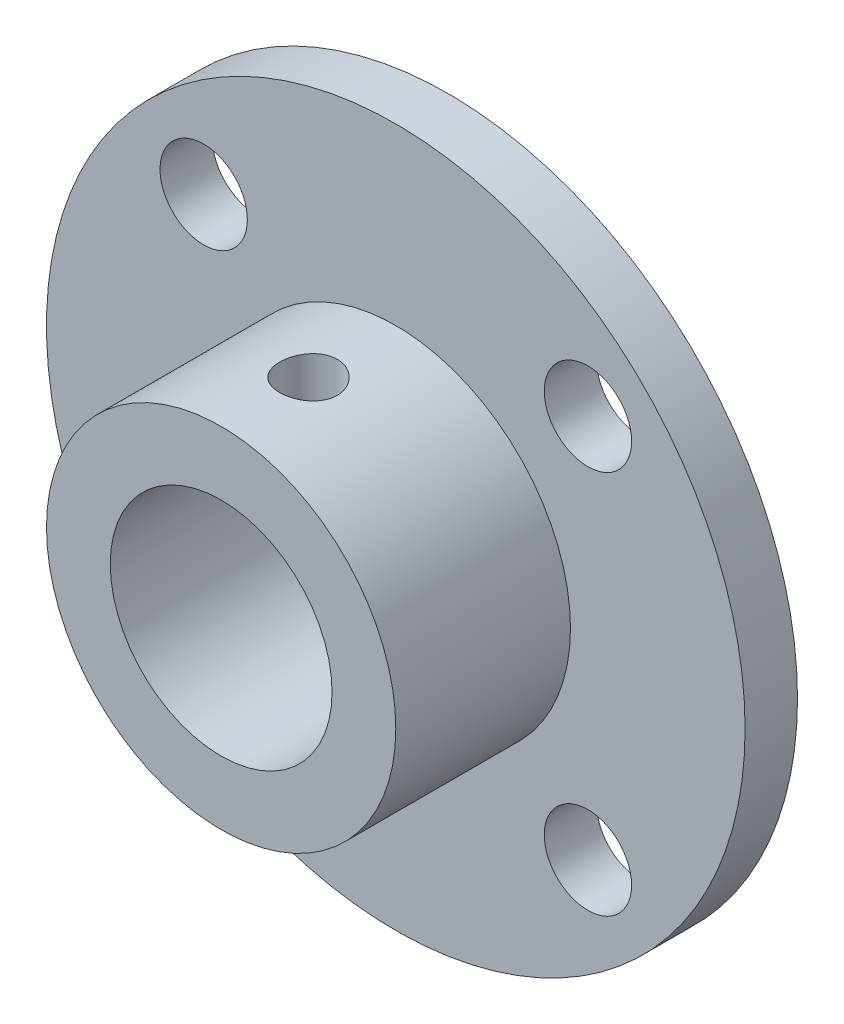
ISO-10303-21;
HEADER;
FILE_DESCRIPTION(('STEP AP214'),'2;1');
FILE_NAME('part.step','',(''),(''),'','','');
FILE_SCHEMA(('AUTOMOTIVE_DESIGN { 1 0 10303 214 1 1 1 1 }'));
ENDSEC;
DATA;
#1=APPLICATION_CONTEXT('core data for automotive mechanical design processes');
#2=APPLICATION_PROTOCOL_DEFINITION('international standard','automotive_design',2000,#1);
#3=PRODUCT_CONTEXT('',#1,'mechanical');
#4=PRODUCT('Part','Part','',(#3));
#5=PRODUCT_RELATED_PRODUCT_CATEGORY('part','',(#4));
#6=PRODUCT_DEFINITION_FORMATION('','',#4);
#7=PRODUCT_DEFINITION_CONTEXT('part definition',#1,'design');
#8=PRODUCT_DEFINITION('design','',#6,#7);
#9=PRODUCT_DEFINITION_SHAPE('','',#8);
#10=(LENGTH_UNIT() NAMED_UNIT(*) SI_UNIT(.MILLI.,.METRE.));
#11=(NAMED_UNIT(*) PLANE_ANGLE_UNIT() SI_UNIT($,.RADIAN.));
#12=(NAMED_UNIT(*) SI_UNIT($,.STERADIAN.) SOLID_ANGLE_UNIT());
#13=UNCERTAINTY_MEASURE_WITH_UNIT(LENGTH_MEASURE(1.E-05),#10,'distance_accuracy_value','');
#14=(GEOMETRIC_REPRESENTATION_CONTEXT(3) GLOBAL_UNCERTAINTY_ASSIGNED_CONTEXT((#13)) GLOBAL_UNIT_ASSIGNED_CONTEXT((#10,
#11,#12)) REPRESENTATION_CONTEXT('',''));
#15=CARTESIAN_POINT('',(0.,0.,0.));
#16=DIRECTION('',(0.,0.,1.));
#17=DIRECTION('',(1.,0.,0.));
#18=AXIS2_PLACEMENT_3D('',#15,#16,#17);
#19=CARTESIAN_POINT('',(0.,0.,3.00000000000003));
#20=DIRECTION('',(0.,0.,-1.00000000000001));
#21=DIRECTION('',(-1.,0.,0.));
#22=AXIS2_PLACEMENT_3D('',#19,#20,#21);
#23=CYLINDRICAL_SURFACE('',#22,20.);
#24=CARTESIAN_POINT('',(0.,0.,3.00000000000003));
#25=DIRECTION('',(0.,0.,1.00000000000001));
#26=DIRECTION('',(1.,0.,0.));
#27=AXIS2_PLACEMENT_3D('',#24,#25,#26);
#28=CIRCLE('',#27,20.);
#29=CARTESIAN_POINT('',(20.,0.,3.00000000000003));
#30=VERTEX_POINT('',#29);
#31=EDGE_CURVE('E12',#30,#30,#28,.T.);
#32=ORIENTED_EDGE('',*,*,#31,.F.);
#33=EDGE_LOOP('',(#32));
#34=FACE_BOUND('',#33,.T.);
#35=CARTESIAN_POINT('',(0.,0.,0.));
#36=DIRECTION('',(0.,0.,1.00000000000001));
#37=DIRECTION('',(1.,0.,0.));
#38=AXIS2_PLACEMENT_3D('',#35,#36,#37);
#39=CIRCLE('',#38,20.);
#40=CARTESIAN_POINT('',(20.,0.,0.));
#41=VERTEX_POINT('',#40);
#42=EDGE_CURVE('E47',#41,#41,#39,.T.);
#43=ORIENTED_EDGE('',*,*,#42,.T.);
#44=EDGE_LOOP('',(#43));
#45=FACE_BOUND('',#44,.T.);
#46=ADVANCED_FACE('F44',(#34,#45),#23,.T.);
#47=CARTESIAN_POINT('',(0.,0.,3.00000000000003));
#48=DIRECTION('',(0.,0.,1.00000000000001));
#49=DIRECTION('',(1.,0.,0.));
#50=AXIS2_PLACEMENT_3D('',#47,#48,#49);
#51=PLANE('',#50);
#52=CARTESIAN_POINT('',(-10.9999999999999,11.0000000000002,3.00000000000003));
#53=DIRECTION('',(0.,0.,1.00000000000001));
#54=DIRECTION('',(1.,0.,0.));
#55=AXIS2_PLACEMENT_3D('',#52,#53,#54);
#56=CIRCLE('',#55,2.5);
#57=CARTESIAN_POINT('',(-8.49999999999989,11.0000000000002,3.00000000000003));
#58=VERTEX_POINT('',#57);
#59=EDGE_CURVE('E154',#58,#58,#56,.T.);
#60=ORIENTED_EDGE('',*,*,#59,.F.);
#61=EDGE_LOOP('',(#60));
#62=FACE_BOUND('',#61,.T.);
#63=CARTESIAN_POINT('',(-11.,-11.,3.00000000000002));
#64=DIRECTION('',(0.,0.,1.00000000000001));
#65=DIRECTION('',(1.,0.,0.));
#66=AXIS2_PLACEMENT_3D('',#63,#64,#65);
#67=CIRCLE('',#66,2.5);
#68=CARTESIAN_POINT('',(-8.49999999999996,-11.,3.00000000000002));
#69=VERTEX_POINT('',#68);
#70=EDGE_CURVE('E150',#69,#69,#67,.T.);
#71=ORIENTED_EDGE('',*,*,#70,.F.);
#72=EDGE_LOOP('',(#71));
#73=FACE_BOUND('',#72,.T.);
#74=CARTESIAN_POINT('',(11.,-11.,3.00000000000002));
#75=DIRECTION('',(0.,0.,1.00000000000001));
#76=DIRECTION('',(1.,0.,0.));
#77=AXIS2_PLACEMENT_3D('',#74,#75,#76);
#78=CIRCLE('',#77,2.5);
#79=CARTESIAN_POINT('',(13.5,-11.,3.00000000000002));
#80=VERTEX_POINT('',#79);
#81=EDGE_CURVE('E146',#80,#80,#78,.T.);
#82=ORIENTED_EDGE('',*,*,#81,.F.);
#83=EDGE_LOOP('',(#82));
#84=FACE_BOUND('',#83,.T.);
#85=CARTESIAN_POINT('',(11.,11.0000000000001,3.00000000000003));
#86=DIRECTION('',(0.,0.,1.00000000000001));
#87=DIRECTION('',(1.,0.,0.));
#88=AXIS2_PLACEMENT_3D('',#85,#86,#87);
#89=CIRCLE('',#88,2.5);
#90=CARTESIAN_POINT('',(13.5,11.0000000000001,3.00000000000003));
#91=VERTEX_POINT('',#90);
#92=EDGE_CURVE('E140',#91,#91,#89,.T.);
#93=ORIENTED_EDGE('',*,*,#92,.F.);
#94=EDGE_LOOP('',(#93));
#95=FACE_BOUND('',#94,.T.);
#96=CARTESIAN_POINT('',(0.,0.,3.00000000000003));
#97=DIRECTION('',(0.,0.,1.00000000000001));
#98=DIRECTION('',(1.,0.,0.));
#99=AXIS2_PLACEMENT_3D('',#96,#97,#98);
#100=CIRCLE('',#99,10.);
#101=CARTESIAN_POINT('',(10.,0.,3.00000000000003));
#102=VERTEX_POINT('',#101);
#103=EDGE_CURVE('E56',#102,#102,#100,.T.);
#104=ORIENTED_EDGE('',*,*,#103,.F.);
#105=EDGE_LOOP('',(#104));
#106=FACE_BOUND('',#105,.T.);
#107=ORIENTED_EDGE('',*,*,#31,.T.);
#108=EDGE_LOOP('',(#107));
#109=FACE_BOUND('',#108,.T.);
#110=ADVANCED_FACE('F107',(#62,#73,#84,#95,#106,#109),#51,.T.);
#111=CARTESIAN_POINT('',(0.,0.,0.));
#112=DIRECTION('',(0.,0.,1.00000000000001));
#113=DIRECTION('',(1.,0.,0.));
#114=AXIS2_PLACEMENT_3D('',#111,#112,#113);
#115=PLANE('',#114);
#116=CARTESIAN_POINT('',(-10.9999999999999,11.0000000000002,0.));
#117=DIRECTION('',(0.,0.,1.00000000000001));
#118=DIRECTION('',(1.,0.,0.));
#119=AXIS2_PLACEMENT_3D('',#116,#117,#118);
#120=CIRCLE('',#119,2.5);
#121=CARTESIAN_POINT('',(-8.49999999999989,11.0000000000002,0.));
#122=VERTEX_POINT('',#121);
#123=EDGE_CURVE('E123',#122,#122,#120,.T.);
#124=ORIENTED_EDGE('',*,*,#123,.T.);
#125=EDGE_LOOP('',(#124));
#126=FACE_BOUND('',#125,.T.);
#127=CARTESIAN_POINT('',(-11.,-11.,0.));
#128=DIRECTION('',(0.,0.,1.00000000000001));
#129=DIRECTION('',(1.,0.,0.));
#130=AXIS2_PLACEMENT_3D('',#127,#128,#129);
#131=CIRCLE('',#130,2.5);
#132=CARTESIAN_POINT('',(-8.49999999999996,-11.,0.));
#133=VERTEX_POINT('',#132);
#134=EDGE_CURVE('E127',#133,#133,#131,.T.);
#135=ORIENTED_EDGE('',*,*,#134,.T.);
#136=EDGE_LOOP('',(#135));
#137=FACE_BOUND('',#136,.T.);
#138=CARTESIAN_POINT('',(11.,-11.,0.));
#139=DIRECTION('',(0.,0.,1.00000000000001));
#140=DIRECTION('',(1.,0.,0.));
#141=AXIS2_PLACEMENT_3D('',#138,#139,#140);
#142=CIRCLE('',#141,2.5);
#143=CARTESIAN_POINT('',(13.5,-11.,0.));
#144=VERTEX_POINT('',#143);
#145=EDGE_CURVE('E131',#144,#144,#142,.T.);
#146=ORIENTED_EDGE('',*,*,#145,.T.);
#147=EDGE_LOOP('',(#146));
#148=FACE_BOUND('',#147,.T.);
#149=CARTESIAN_POINT('',(11.,11.0000000000001,0.));
#150=DIRECTION('',(0.,0.,1.00000000000001));
#151=DIRECTION('',(1.,0.,0.));
#152=AXIS2_PLACEMENT_3D('',#149,#150,#151);
#153=CIRCLE('',#152,2.5);
#154=CARTESIAN_POINT('',(13.5,11.0000000000001,0.));
#155=VERTEX_POINT('',#154);
#156=EDGE_CURVE('E135',#155,#155,#153,.T.);
#157=ORIENTED_EDGE('',*,*,#156,.T.);
#158=EDGE_LOOP('',(#157));
#159=FACE_BOUND('',#158,.T.);
#160=CARTESIAN_POINT('',(0.,0.,0.));
#161=DIRECTION('',(0.,0.,1.00000000000001));
#162=DIRECTION('',(1.,0.,0.));
#163=AXIS2_PLACEMENT_3D('',#160,#161,#162);
#164=CIRCLE('',#163,6.35);
#165=CARTESIAN_POINT('',(6.35,0.,0.));
#166=VERTEX_POINT('',#165);
#167=EDGE_CURVE('E59',#166,#166,#164,.T.);
#168=ORIENTED_EDGE('',*,*,#167,.T.);
#169=EDGE_LOOP('',(#168));
#170=FACE_BOUND('',#169,.T.);
#171=ORIENTED_EDGE('',*,*,#42,.F.);
#172=EDGE_LOOP('',(#171));
#173=FACE_BOUND('',#172,.T.);
#174=ADVANCED_FACE('F102',(#126,#137,#148,#159,#170,#173),#115,.F.);
#175=CARTESIAN_POINT('',(0.,0.,13.0000000000001));
#176=DIRECTION('',(0.,0.,-1.00000000000001));
#177=DIRECTION('',(-1.,0.,0.));
#178=AXIS2_PLACEMENT_3D('',#175,#176,#177);
#179=CYLINDRICAL_SURFACE('',#178,10.);
#180=CARTESIAN_POINT('',(0.,10.0000000000001,9.65000000000004));
#181=CARTESIAN_POINT('',(-0.0920114531057493,9.99999843258111,9.64999629901474));
#182=CARTESIAN_POINT('',(-0.184073454347168,9.99871684765511,9.64227754131463));
#183=CARTESIAN_POINT('',(-0.365616322535326,9.9937277549638,9.61161876486211));
#184=CARTESIAN_POINT('',(-0.455094721351769,9.9900180027217,9.58866466304124));
#185=CARTESIAN_POINT('',(-0.628817487751612,9.98058875631562,9.52824636106413));
#186=CARTESIAN_POINT('',(-0.713066038744477,9.974870893487,9.49079393643974));
#187=CARTESIAN_POINT('',(-0.874072236504033,9.96205444853337,9.40247274585142));
#188=CARTESIAN_POINT('',(-0.950830757653326,9.95495602786433,9.35160554849504));
#189=CARTESIAN_POINT('',(-1.09540879372212,9.9400912001719,9.23739122286713));
#190=CARTESIAN_POINT('',(-1.16314787882338,9.93231968689365,9.1739429363818));
#191=CARTESIAN_POINT('',(-1.28706950777734,9.91702374723339,9.03658522640682));
#192=CARTESIAN_POINT('',(-1.34325132909588,9.90949933632437,8.96267514935686));
#193=CARTESIAN_POINT('',(-1.44278500045253,9.89550007731651,8.80594065632337));
#194=CARTESIAN_POINT('',(-1.48605749570898,9.88903182722124,8.72306520565617));
#195=CARTESIAN_POINT('',(-1.55803674048924,9.87794796970923,8.55109737476356));
#196=CARTESIAN_POINT('',(-1.58674445381555,9.873332239709,8.46200540635077));
#197=CARTESIAN_POINT('',(-1.62852619503009,9.86652679242383,8.28098541799906));
#198=CARTESIAN_POINT('',(-1.64173895927951,9.86431555933323,8.18909024432129));
#199=CARTESIAN_POINT('',(-1.65258585530686,9.86250435770823,8.00436263407662));
#200=CARTESIAN_POINT('',(-1.65022106770359,9.86290420804228,7.91153026296942));
#201=CARTESIAN_POINT('',(-1.63009303176277,9.86625034802642,7.72855272294334));
#202=CARTESIAN_POINT('',(-1.61248549472487,9.86917088684506,7.63838988597268));
#203=CARTESIAN_POINT('',(-1.56261607367809,9.87718903199042,7.46231592946667));
#204=CARTESIAN_POINT('',(-1.53035369619837,9.88228671162742,7.37640495321179));
#205=CARTESIAN_POINT('',(-1.45193210975571,9.89411264039683,7.21080647007565));
#206=CARTESIAN_POINT('',(-1.4057081060585,9.90084846298694,7.13115021075937));
#207=CARTESIAN_POINT('',(-1.30072141548377,9.9151864393107,6.9806656760923));
#208=CARTESIAN_POINT('',(-1.24195773629987,9.92278866158326,6.90983810008778));
#209=CARTESIAN_POINT('',(-1.11271072676602,9.93811607124004,6.77812002111739));
#210=CARTESIAN_POINT('',(-1.04209376928222,9.94584163094155,6.7173606053701));
#211=CARTESIAN_POINT('',(-0.891597059898562,9.96045987838133,6.60853397839379));
#212=CARTESIAN_POINT('',(-0.811717250503355,9.9673525609493,6.56046684595297));
#213=CARTESIAN_POINT('',(-0.644840083170751,9.97953794169539,6.47837784946575));
#214=CARTESIAN_POINT('',(-0.557837003156556,9.98482933722618,6.44436741236203));
#215=CARTESIAN_POINT('',(-0.379246930002468,9.99320544362232,6.39147808722471));
#216=CARTESIAN_POINT('',(-0.28766031326082,9.99629033536777,6.37259795885528));
#217=CARTESIAN_POINT('',(-0.103632983819162,9.99988156603316,6.35068253883889));
#218=CARTESIAN_POINT('',(-0.0112142564118363,10.0004171933872,6.34746726387852));
#219=CARTESIAN_POINT('',(0.17284150555468,9.99892971175882,6.35649319868032));
#220=CARTESIAN_POINT('',(0.264478569441163,9.99690669920305,6.36873382596054));
#221=CARTESIAN_POINT('',(0.443814955541767,9.99054737820408,6.40817440277716));
#222=CARTESIAN_POINT('',(0.531534371938299,9.98622483070291,6.43528539430841));
#223=CARTESIAN_POINT('',(0.701182959294589,9.97574921956607,6.50360239255513));
#224=CARTESIAN_POINT('',(0.783111810188987,9.96959605484337,6.54480917766175));
#225=CARTESIAN_POINT('',(0.939636398877249,9.95606928426956,6.64056131949905));
#226=CARTESIAN_POINT('',(1.01416235726447,9.94868555427358,6.69521928591715));
#227=CARTESIAN_POINT('',(1.15304841333208,9.93354765732487,6.81616714906884));
#228=CARTESIAN_POINT('',(1.21740778758216,9.92579346406192,6.88245787285436));
#229=CARTESIAN_POINT('',(1.33479962911472,9.91069407401686,7.02559610632836));
#230=CARTESIAN_POINT('',(1.38771058951943,9.90335382329475,7.10254387109887));
#231=CARTESIAN_POINT('',(1.47985547415616,9.89000528724128,7.26434104706752));
#232=CARTESIAN_POINT('',(1.51908982562647,9.8839969603046,7.34919021133198));
#233=CARTESIAN_POINT('',(1.58258535747086,9.87402953570162,7.52403953240322));
#234=CARTESIAN_POINT('',(1.60690737863648,9.87006212213643,7.61401709979673));
#235=CARTESIAN_POINT('',(1.64007952798876,9.86460473721113,7.79685131178061));
#236=CARTESIAN_POINT('',(1.64893097191818,9.86311455516779,7.88970771084821));
#237=CARTESIAN_POINT('',(1.65087457438795,9.86278931217117,8.07445064130186));
#238=CARTESIAN_POINT('',(1.64415796786953,9.86392203182987,8.16633516019216));
#239=CARTESIAN_POINT('',(1.61556925478546,9.86864441177182,8.34764775186392));
#240=CARTESIAN_POINT('',(1.59369719454886,9.87223406454443,8.43707583215364));
#241=CARTESIAN_POINT('',(1.53549112071356,9.88145370519215,8.61086524243546));
#242=CARTESIAN_POINT('',(1.49917324977365,9.88708141498759,8.69523210745102));
#243=CARTESIAN_POINT('',(1.41312606218934,9.89974533231771,8.85670626686037));
#244=CARTESIAN_POINT('',(1.36339610211421,9.90678160742262,8.93381321272778));
#245=CARTESIAN_POINT('',(1.25125259966706,9.92157214136353,9.07954549763774));
#246=CARTESIAN_POINT('',(1.18869826623125,9.92933379899765,9.14806175981962));
#247=CARTESIAN_POINT('',(1.05297867490408,9.94464125601211,9.27369059987681));
#248=CARTESIAN_POINT('',(0.979810970092669,9.95218700513296,9.33080054078028));
#249=CARTESIAN_POINT('',(0.824354696103046,9.96627143049851,9.43234742257353));
#250=CARTESIAN_POINT('',(0.742007852048181,9.97280295936928,9.47669614797807));
#251=CARTESIAN_POINT('',(0.570959586923788,9.98405342047582,9.55086335280635));
#252=CARTESIAN_POINT('',(0.482264623543762,9.98877416450839,9.58069636412529));
#253=CARTESIAN_POINT('',(0.327682758240929,9.99483601455813,9.61847934152689));
#254=CARTESIAN_POINT('',(0.262733066711098,9.99676220083327,9.63028074881454));
#255=CARTESIAN_POINT('',(0.131864227625938,9.99934474465587,9.64604233893315));
#256=CARTESIAN_POINT('',(0.0659450962546676,10.0000011233776,9.65000265251583));
#257=CARTESIAN_POINT('',(0.,10.0000000000001,9.65000000000004));
#258=B_SPLINE_CURVE_WITH_KNOTS('',3,(#180,#181,#182,#183,#184,#185,#186,#187,#188,#189,#190,
#191,#192,#193,#194,#195,#196,#197,#198,#199,#200,#201,#202,#203,#204,#205,#206,#207,#208,#209,
#210,#211,#212,#213,#214,#215,#216,#217,#218,#219,#220,#221,#222,#223,#224,#225,#226,#227,#228,
#229,#230,#231,#232,#233,#234,#235,#236,#237,#238,#239,#240,#241,#242,#243,#244,#245,#246,#247,
#248,#249,#250,#251,#252,#253,#254,#255,#256,#257),.UNSPECIFIED.,.T.,.F.,(4,2,2,2,2,2,2,2,2,2,2,
2,2,2,2,2,2,2,2,2,2,2,2,2,2,2,2,2,2,2,2,2,2,2,2,2,2,2,4),(0.,0.275793319008916,
0.551841928312969,0.827666799870594,1.1034594331417,1.38156673144315,1.65969141110741,
1.93949209608633,2.21927426326044,2.49653175525206,2.77377001402269,3.04820914252875,
3.32265751287869,3.5983996732004,3.87416366201706,4.15327572401919,4.43238951858747,
4.71172976565331,4.991047110928,5.26714751096616,5.54323750600188,5.81769359979003,
6.09216485190802,6.36901711215385,6.64588906369256,6.92556925596458,7.20524071063228,
7.48376340648032,7.76226241335694,8.03735855216243,8.312453850024,8.58724259883657,
8.86204453269314,9.14004258759616,9.4181048373113,9.69804546871316,9.97770526783279,
10.1753710978727,10.3730336317698),.UNSPECIFIED.);
#259=CARTESIAN_POINT('',(0.,10.0000000000001,9.65000000000004));
#260=VERTEX_POINT('',#259);
#261=EDGE_CURVE('E65',#260,#260,#258,.T.);
#262=ORIENTED_EDGE('',*,*,#261,.T.);
#263=EDGE_LOOP('',(#262));
#264=FACE_BOUND('',#263,.T.);
#265=CARTESIAN_POINT('',(0.,0.,13.0000000000001));
#266=DIRECTION('',(0.,0.,1.00000000000001));
#267=DIRECTION('',(1.,0.,0.));
#268=AXIS2_PLACEMENT_3D('',#265,#266,#267);
#269=CIRCLE('',#268,10.);
#270=CARTESIAN_POINT('',(10.,0.,13.0000000000001));
#271=VERTEX_POINT('',#270);
#272=EDGE_CURVE('E54',#271,#271,#269,.T.);
#273=ORIENTED_EDGE('',*,*,#272,.F.);
#274=EDGE_LOOP('',(#273));
#275=FACE_BOUND('',#274,.T.);
#276=ORIENTED_EDGE('',*,*,#103,.T.);
#277=EDGE_LOOP('',(#276));
#278=FACE_BOUND('',#277,.T.);
#279=ADVANCED_FACE('F79',(#264,#275,#278),#179,.T.);
#280=CARTESIAN_POINT('',(0.,0.,13.0000000000001));
#281=DIRECTION('',(0.,0.,1.00000000000001));
#282=DIRECTION('',(1.,0.,0.));
#283=AXIS2_PLACEMENT_3D('',#280,#281,#282);
#284=PLANE('',#283);
#285=CARTESIAN_POINT('',(0.,0.,13.0000000000001));
#286=DIRECTION('',(0.,0.,1.00000000000001));
#287=DIRECTION('',(1.,0.,0.));
#288=AXIS2_PLACEMENT_3D('',#285,#286,#287);
#289=CIRCLE('',#288,6.35);
#290=CARTESIAN_POINT('',(6.35,0.,13.0000000000001));
#291=VERTEX_POINT('',#290);
#292=EDGE_CURVE('E62',#291,#291,#289,.T.);
#293=ORIENTED_EDGE('',*,*,#292,.F.);
#294=EDGE_LOOP('',(#293));
#295=FACE_BOUND('',#294,.T.);
#296=ORIENTED_EDGE('',*,*,#272,.T.);
#297=EDGE_LOOP('',(#296));
#298=FACE_BOUND('',#297,.T.);
#299=ADVANCED_FACE('F95',(#295,#298),#284,.T.);
#300=CARTESIAN_POINT('',(0.,0.,0.));
#301=DIRECTION('',(0.,0.,1.00000000000001));
#302=DIRECTION('',(1.,0.,0.));
#303=AXIS2_PLACEMENT_3D('',#300,#301,#302);
#304=CYLINDRICAL_SURFACE('',#303,6.35);
#305=CARTESIAN_POINT('',(0.,6.3500000000001,9.65000000000004));
#306=CARTESIAN_POINT('',(0.0910448468003053,6.34999855029444,9.64999766821717));
#307=CARTESIAN_POINT('',(0.182115106595801,6.34802256023355,9.64243909475028));
#308=CARTESIAN_POINT('',(0.361637722456887,6.34033166229605,9.61245458536109));
#309=CARTESIAN_POINT('',(0.450088700922075,6.33461482219976,9.59002096611705));
#310=CARTESIAN_POINT('',(0.6217550158064,6.32007407349416,9.53106074689396));
#311=CARTESIAN_POINT('',(0.704976759571168,6.31125405827411,9.49455180100858));
#312=CARTESIAN_POINT('',(0.864115385464052,6.29144207556039,9.40854134953766));
#313=CARTESIAN_POINT('',(0.940031879382961,6.28044999273528,9.3590391539967));
#314=CARTESIAN_POINT('',(1.08408361281691,6.25721162305253,9.24729153753454));
#315=CARTESIAN_POINT('',(1.15203430762349,6.24494475819511,9.18481249487555));
#316=CARTESIAN_POINT('',(1.27662045234931,6.22067339979482,9.04938446537812));
#317=CARTESIAN_POINT('',(1.33325452218133,6.20866893841142,8.97643420341334));
#318=CARTESIAN_POINT('',(1.43448627284162,6.18607236088656,8.82067821330165));
#319=CARTESIAN_POINT('',(1.47887409675302,6.17550627575629,8.73773196930929));
#320=CARTESIAN_POINT('',(1.5530025514422,6.15728432495074,8.56523540998527));
#321=CARTESIAN_POINT('',(1.58274573213215,6.14962795269185,8.47568624747211));
#322=CARTESIAN_POINT('',(1.62610440704153,6.13830437157219,8.29456365189158));
#323=CARTESIAN_POINT('',(1.64005334721509,6.13455482406808,8.20307531267077));
#324=CARTESIAN_POINT('',(1.65246676688996,6.13122323298145,8.01898616375629));
#325=CARTESIAN_POINT('',(1.65093398237215,6.13164045303402,7.92638555351578));
#326=CARTESIAN_POINT('',(1.63269273382031,6.13652142945017,7.74528332696161));
#327=CARTESIAN_POINT('',(1.61638516940252,6.14087828157327,7.65673799460433));
#328=CARTESIAN_POINT('',(1.56969829391198,6.15297677618063,7.48368526939021));
#329=CARTESIAN_POINT('',(1.53931790895913,6.16071867697136,7.39917818523025));
#330=CARTESIAN_POINT('',(1.46501490019536,6.17881066459301,7.23554333307102));
#331=CARTESIAN_POINT('',(1.42094967522962,6.18918799570479,7.15648345628389));
#332=CARTESIAN_POINT('',(1.32062741969185,6.21136663029631,7.00673810476461));
#333=CARTESIAN_POINT('',(1.26436809941903,6.22316820102264,6.93605420666127));
#334=CARTESIAN_POINT('',(1.13919365005044,6.247312708951,6.80277385101087));
#335=CARTESIAN_POINT('',(1.06994116814557,6.2596611060113,6.74049479223201));
#336=CARTESIAN_POINT('',(0.921825284419531,6.28318013507778,6.62837115598699));
#337=CARTESIAN_POINT('',(0.842961540881453,6.2943507251821,6.57852702082175));
#338=CARTESIAN_POINT('',(0.677386395199797,6.31431860148121,6.49255811708188));
#339=CARTESIAN_POINT('',(0.590645218331428,6.32310633647018,6.45648833126519));
#340=CARTESIAN_POINT('',(0.412050348558323,6.33724917222536,6.3995330425478));
#341=CARTESIAN_POINT('',(0.320197718854885,6.34260498396535,6.37864439452897));
#342=CARTESIAN_POINT('',(0.136698103214808,6.34917395795859,6.35313700471358));
#343=CARTESIAN_POINT('',(0.0451149873460256,6.35049704173526,6.34808644500944));
#344=CARTESIAN_POINT('',(-0.137588879967505,6.34916628370759,6.35320947922105));
#345=CARTESIAN_POINT('',(-0.228709675740831,6.34651283070251,6.3633815847659));
#346=CARTESIAN_POINT('',(-0.406378044073721,6.33759791632778,6.39830624985756));
#347=CARTESIAN_POINT('',(-0.492975765461384,6.33139554722162,6.42282015381398));
#348=CARTESIAN_POINT('',(-0.660823076794114,6.31608436911729,6.48545731139702));
#349=CARTESIAN_POINT('',(-0.742072101711469,6.30697525364753,6.5235820001214));
#350=CARTESIAN_POINT('',(-0.898610320905372,6.28660102926509,6.61317437732953));
#351=CARTESIAN_POINT('',(-0.973758422974695,6.27529854070213,6.66487987616065));
#352=CARTESIAN_POINT('',(-1.11446374988073,6.25184511462951,6.77986511544992));
#353=CARTESIAN_POINT('',(-1.18001917564772,6.23969401859643,6.84314702202426));
#354=CARTESIAN_POINT('',(-1.30148131934472,6.21551205555081,6.98149988995485));
#355=CARTESIAN_POINT('',(-1.35708406366279,6.20349303878838,7.05684026247028));
#356=CARTESIAN_POINT('',(-1.4548612076364,6.1812945570822,7.21603386158318));
#357=CARTESIAN_POINT('',(-1.49703618671815,6.17111501277092,7.29988672064937));
#358=CARTESIAN_POINT('',(-1.56644342790352,6.1538633886005,7.47329096623367));
#359=CARTESIAN_POINT('',(-1.59376344846781,6.14677310890372,7.56280531908237));
#360=CARTESIAN_POINT('',(-1.63290364352221,6.1364927236705,7.74537138000059));
#361=CARTESIAN_POINT('',(-1.64472753735071,6.13330168226187,7.83842223372943));
#362=CARTESIAN_POINT('',(-1.65233394666401,6.13125643136571,8.02231585308348));
#363=CARTESIAN_POINT('',(-1.64860385935212,6.13227044727086,8.11313730303774));
#364=CARTESIAN_POINT('',(-1.62633248920674,6.1382141374606,8.29280839889533));
#365=CARTESIAN_POINT('',(-1.60779155168881,6.14314372045355,8.38165809072066));
#366=CARTESIAN_POINT('',(-1.55670066869661,6.15628671879353,8.55428493366118));
#367=CARTESIAN_POINT('',(-1.52424906376861,6.16447705404005,8.6380930694245));
#368=CARTESIAN_POINT('',(-1.44633487299293,6.1832203458807,8.79913727938752));
#369=CARTESIAN_POINT('',(-1.40087034238606,6.1937736555659,8.87637236901692));
#370=CARTESIAN_POINT('',(-1.2967225755824,6.2164235298059,9.02441659876633));
#371=CARTESIAN_POINT('',(-1.23770439442364,6.22855507321493,9.0949847909386));
#372=CARTESIAN_POINT('',(-1.10876820201016,6.25279366601997,9.22537430949528));
#373=CARTESIAN_POINT('',(-1.03884757177488,6.26490070882074,9.28519304619997));
#374=CARTESIAN_POINT('',(-0.888403621483169,6.28801547883306,9.3935578156404));
#375=CARTESIAN_POINT('',(-0.807696217223395,6.29899637718776,9.4418544691497));
#376=CARTESIAN_POINT('',(-0.639026945353653,6.31833266373968,9.52411790176239));
#377=CARTESIAN_POINT('',(-0.55107000918276,6.32668981840995,9.55809432746539));
#378=CARTESIAN_POINT('',(-0.386139089142769,6.33869137211516,9.60606475362172));
#379=CARTESIAN_POINT('',(-0.309908192256334,6.34290195111591,9.62250332676015));
#380=CARTESIAN_POINT('',(-0.155790967896644,6.34855676301915,9.6444714653745));
#381=CARTESIAN_POINT('',(-0.0779047873851484,6.3500012404768,9.65000199524805));
#382=CARTESIAN_POINT('',(0.,6.3500000000001,9.65000000000004));
#383=B_SPLINE_CURVE_WITH_KNOTS('',3,(#305,#306,#307,#308,#309,#310,#311,#312,#313,#314,#315,
#316,#317,#318,#319,#320,#321,#322,#323,#324,#325,#326,#327,#328,#329,#330,#331,#332,#333,#334,
#335,#336,#337,#338,#339,#340,#341,#342,#343,#344,#345,#346,#347,#348,#349,#350,#351,#352,#353,
#354,#355,#356,#357,#358,#359,#360,#361,#362,#363,#364,#365,#366,#367,#368,#369,#370,#371,#372,
#373,#374,#375,#376,#377,#378,#379,#380,#381,#382),.UNSPECIFIED.,.T.,.F.,(4,2,2,2,2,2,2,2,2,2,2,
2,2,2,2,2,2,2,2,2,2,2,2,2,2,2,2,2,2,2,2,2,2,2,2,2,2,2,4),(0.,0.272848929366457,
0.545838901719082,0.818487582289897,1.09115074372663,1.36923066335054,1.647344474761,
1.92996381752701,2.21253393344859,2.489020237786,2.76545768141703,3.03461179177954,
3.30378644435437,3.57586585501713,3.84799639870399,4.12853593267049,4.40908544379588,
4.69074339517813,4.97234297805995,5.24619498691972,5.52002022210173,5.78941347984937,
6.0588351503525,6.33333182956838,6.60787992378505,6.88975050237244,7.17160891621464,
7.45178358912649,7.73189100294891,8.0032880548191,8.27467877924089,8.54418177129591,
8.81372506115521,9.09082731912146,9.36799624528848,9.6507085023632,9.93323000913875,
10.1667206253154,10.4001905972863),.UNSPECIFIED.);
#384=CARTESIAN_POINT('',(0.,6.3500000000001,9.65000000000004));
#385=VERTEX_POINT('',#384);
#386=EDGE_CURVE('E74',#385,#385,#383,.T.);
#387=ORIENTED_EDGE('',*,*,#386,.T.);
#388=EDGE_LOOP('',(#387));
#389=FACE_BOUND('',#388,.T.);
#390=ORIENTED_EDGE('',*,*,#167,.F.);
#391=EDGE_LOOP('',(#390));
#392=FACE_BOUND('',#391,.T.);
#393=ORIENTED_EDGE('',*,*,#292,.T.);
#394=EDGE_LOOP('',(#393));
#395=FACE_BOUND('',#394,.T.);
#396=ADVANCED_FACE('F88',(#389,#392,#395),#304,.F.);
#397=CARTESIAN_POINT('',(0.,10.0000000000001,8.00000000000005));
#398=DIRECTION('',(0.,1.00000000000001,0.));
#399=DIRECTION('',(0.,0.,1.00000000000001));
#400=AXIS2_PLACEMENT_3D('',#397,#398,#399);
#401=CYLINDRICAL_SURFACE('',#400,1.64999999999999);
#402=ORIENTED_EDGE('',*,*,#386,.F.);
#403=EDGE_LOOP('',(#402));
#404=FACE_BOUND('',#403,.T.);
#405=ORIENTED_EDGE('',*,*,#261,.F.);
#406=EDGE_LOOP('',(#405));
#407=FACE_BOUND('',#406,.T.);
#408=ADVANCED_FACE('F83',(#404,#407),#401,.F.);
#409=CARTESIAN_POINT('',(11.,11.0000000000001,3.00000000000003));
#410=DIRECTION('',(0.,0.,1.00000000000001));
#411=DIRECTION('',(1.,0.,0.));
#412=AXIS2_PLACEMENT_3D('',#409,#410,#411);
#413=CYLINDRICAL_SURFACE('',#412,2.5);
#414=ORIENTED_EDGE('',*,*,#156,.F.);
#415=EDGE_LOOP('',(#414));
#416=FACE_BOUND('',#415,.T.);
#417=ORIENTED_EDGE('',*,*,#92,.T.);
#418=EDGE_LOOP('',(#417));
#419=FACE_BOUND('',#418,.T.);
#420=ADVANCED_FACE('F87',(#416,#419),#413,.F.);
#421=CARTESIAN_POINT('',(11.,-11.,3.00000000000002));
#422=DIRECTION('',(0.,0.,1.00000000000001));
#423=DIRECTION('',(1.,0.,0.));
#424=AXIS2_PLACEMENT_3D('',#421,#422,#423);
#425=CYLINDRICAL_SURFACE('',#424,2.5);
#426=ORIENTED_EDGE('',*,*,#145,.F.);
#427=EDGE_LOOP('',(#426));
#428=FACE_BOUND('',#427,.T.);
#429=ORIENTED_EDGE('',*,*,#81,.T.);
#430=EDGE_LOOP('',(#429));
#431=FACE_BOUND('',#430,.T.);
#432=ADVANCED_FACE('F170',(#428,#431),#425,.F.);
#433=CARTESIAN_POINT('',(-11.,-11.,3.00000000000002));
#434=DIRECTION('',(0.,0.,1.00000000000001));
#435=DIRECTION('',(1.,0.,0.));
#436=AXIS2_PLACEMENT_3D('',#433,#434,#435);
#437=CYLINDRICAL_SURFACE('',#436,2.5);
#438=ORIENTED_EDGE('',*,*,#134,.F.);
#439=EDGE_LOOP('',(#438));
#440=FACE_BOUND('',#439,.T.);
#441=ORIENTED_EDGE('',*,*,#70,.T.);
#442=EDGE_LOOP('',(#441));
#443=FACE_BOUND('',#442,.T.);
#444=ADVANCED_FACE('F174',(#440,#443),#437,.F.);
#445=CARTESIAN_POINT('',(-10.9999999999999,11.0000000000002,3.00000000000003));
#446=DIRECTION('',(0.,0.,1.00000000000001));
#447=DIRECTION('',(1.,0.,0.));
#448=AXIS2_PLACEMENT_3D('',#445,#446,#447);
#449=CYLINDRICAL_SURFACE('',#448,2.5);
#450=ORIENTED_EDGE('',*,*,#123,.F.);
#451=EDGE_LOOP('',(#450));
#452=FACE_BOUND('',#451,.T.);
#453=ORIENTED_EDGE('',*,*,#59,.T.);
#454=EDGE_LOOP('',(#453));
#455=FACE_BOUND('',#454,.T.);
#456=ADVANCED_FACE('F158',(#452,#455),#449,.F.);
#457=CLOSED_SHELL('',(#46,#110,#174,#279,#299,#396,#408,#420,#432,#444,#456));
#458=MANIFOLD_SOLID_BREP('B2',#457);
#459=ADVANCED_BREP_SHAPE_REPRESENTATION('',(#18,#458),#14);
#460=SHAPE_DEFINITION_REPRESENTATION(#9,#459);
ENDSEC;
END-ISO-10303-21;
